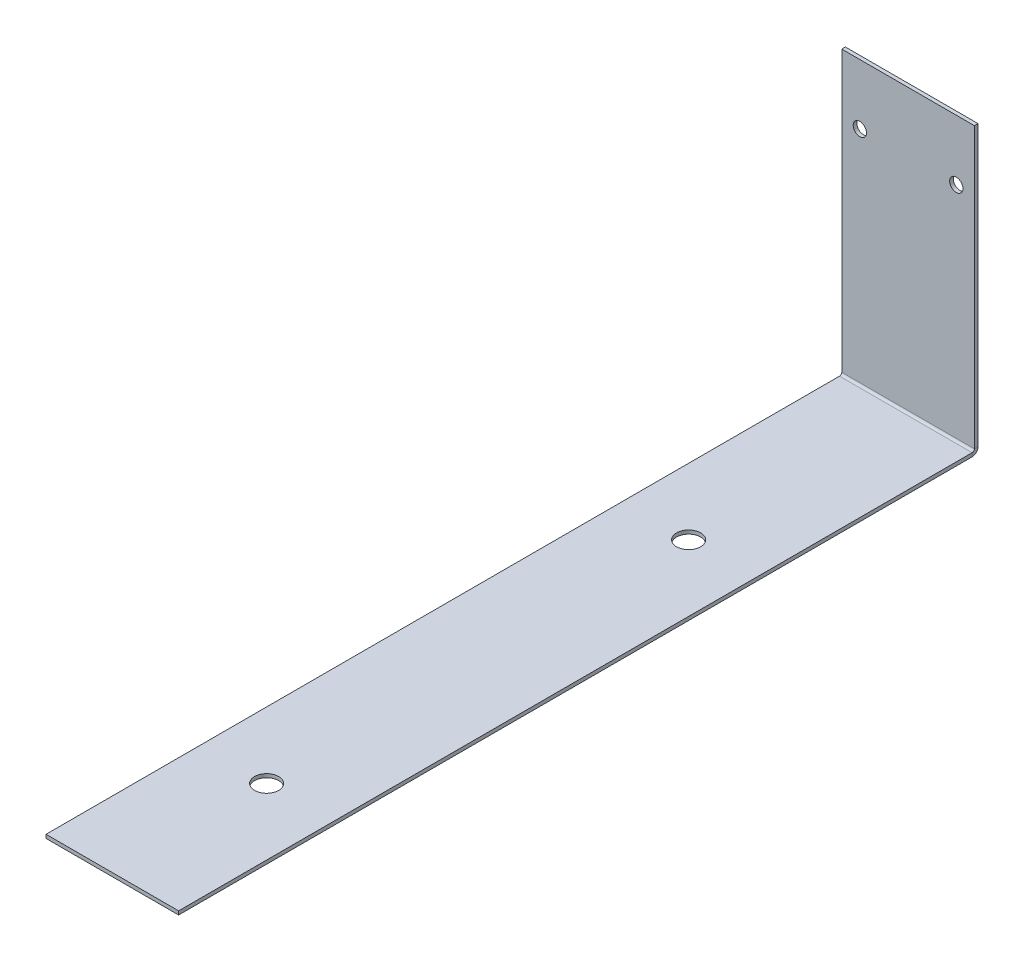
ISO-10303-21;
HEADER;
FILE_DESCRIPTION(('STEP AP214'),'2;1');
FILE_NAME('part.step','',(''),(''),'','','');
FILE_SCHEMA(('AUTOMOTIVE_DESIGN { 1 0 10303 214 1 1 1 1 }'));
ENDSEC;
DATA;
#1=APPLICATION_CONTEXT('core data for automotive mechanical design processes');
#2=APPLICATION_PROTOCOL_DEFINITION('international standard','automotive_design',2000,#1);
#3=PRODUCT_CONTEXT('',#1,'mechanical');
#4=PRODUCT('Part','Part','',(#3));
#5=PRODUCT_RELATED_PRODUCT_CATEGORY('part','',(#4));
#6=PRODUCT_DEFINITION_FORMATION('','',#4);
#7=PRODUCT_DEFINITION_CONTEXT('part definition',#1,'design');
#8=PRODUCT_DEFINITION('design','',#6,#7);
#9=PRODUCT_DEFINITION_SHAPE('','',#8);
#10=(LENGTH_UNIT() NAMED_UNIT(*) SI_UNIT(.MILLI.,.METRE.));
#11=(NAMED_UNIT(*) PLANE_ANGLE_UNIT() SI_UNIT($,.RADIAN.));
#12=(NAMED_UNIT(*) SI_UNIT($,.STERADIAN.) SOLID_ANGLE_UNIT());
#13=UNCERTAINTY_MEASURE_WITH_UNIT(LENGTH_MEASURE(1.E-05),#10,'distance_accuracy_value','');
#14=(GEOMETRIC_REPRESENTATION_CONTEXT(3) GLOBAL_UNCERTAINTY_ASSIGNED_CONTEXT((#13)) GLOBAL_UNIT_ASSIGNED_CONTEXT((#10,
#11,#12)) REPRESENTATION_CONTEXT('',''));
#15=CARTESIAN_POINT('',(0.,0.,0.));
#16=DIRECTION('',(0.,0.,1.));
#17=DIRECTION('',(1.,0.,0.));
#18=AXIS2_PLACEMENT_3D('',#15,#16,#17);
#19=CARTESIAN_POINT('',(0.,-86.4,-84.0000000000003));
#20=DIRECTION('',(0.,0.,-1.));
#21=DIRECTION('',(0.,1.,0.));
#22=AXIS2_PLACEMENT_3D('',#19,#20,#21);
#23=PLANE('',#22);
#24=CARTESIAN_POINT('',(15.9999999999999,73.5999999999999,-83.9999999999998));
#25=DIRECTION('',(0.,0.,-1.));
#26=DIRECTION('',(0.,1.,0.));
#27=AXIS2_PLACEMENT_3D('',#24,#25,#26);
#28=CIRCLE('',#27,2.20564156926429);
#29=CARTESIAN_POINT('',(15.9999999999999,75.8056415692642,-83.9999999999998));
#30=VERTEX_POINT('',#29);
#31=EDGE_CURVE('E216',#30,#30,#28,.T.);
#32=ORIENTED_EDGE('',*,*,#31,.T.);
#33=EDGE_LOOP('',(#32));
#34=FACE_BOUND('',#33,.T.);
#35=CARTESIAN_POINT('',(-16.0000000000001,73.5999999999999,-83.9999999999997));
#36=DIRECTION('',(0.,0.,-1.));
#37=DIRECTION('',(0.,1.,0.));
#38=AXIS2_PLACEMENT_3D('',#35,#36,#37);
#39=CIRCLE('',#38,2.20564156926428);
#40=CARTESIAN_POINT('',(-16.0000000000001,75.8056415692642,-83.9999999999997));
#41=VERTEX_POINT('',#40);
#42=EDGE_CURVE('E211',#41,#41,#39,.T.);
#43=ORIENTED_EDGE('',*,*,#42,.T.);
#44=EDGE_LOOP('',(#43));
#45=FACE_BOUND('',#44,.T.);
#46=DIRECTION('',(0.,-1.,0.));
#47=VECTOR('',#46,1.);
#48=CARTESIAN_POINT('',(-22.,93.6,-83.9999999999997));
#49=LINE('',#48,#47);
#50=CARTESIAN_POINT('',(-22.,93.6,-83.9999999999997));
#51=VERTEX_POINT('',#50);
#52=CARTESIAN_POINT('',(-22.,0.736600000000018,-84.));
#53=VERTEX_POINT('',#52);
#54=EDGE_CURVE('E66',#51,#53,#49,.T.);
#55=ORIENTED_EDGE('',*,*,#54,.T.);
#56=DIRECTION('',(1.,0.,0.));
#57=VECTOR('',#56,1.);
#58=CARTESIAN_POINT('',(0.,0.73659999999999,-84.));
#59=LINE('',#58,#57);
#60=CARTESIAN_POINT('',(22.,0.736600000000018,-84.));
#61=VERTEX_POINT('',#60);
#62=EDGE_CURVE('E58',#53,#61,#59,.T.);
#63=ORIENTED_EDGE('',*,*,#62,.T.);
#64=DIRECTION('',(0.,1.,0.));
#65=VECTOR('',#64,1.);
#66=CARTESIAN_POINT('',(22.,93.6,-83.9999999999997));
#67=LINE('',#66,#65);
#68=CARTESIAN_POINT('',(22.,93.6,-83.9999999999997));
#69=VERTEX_POINT('',#68);
#70=EDGE_CURVE('E74',#61,#69,#67,.T.);
#71=ORIENTED_EDGE('',*,*,#70,.T.);
#72=DIRECTION('',(-1.,0.,0.));
#73=VECTOR('',#72,1.);
#74=CARTESIAN_POINT('',(22.,93.6,-83.9999999999997));
#75=LINE('',#74,#73);
#76=EDGE_CURVE('E177',#69,#51,#75,.T.);
#77=ORIENTED_EDGE('',*,*,#76,.T.);
#78=EDGE_LOOP('',(#55,#63,#71,#77));
#79=FACE_BOUND('',#78,.T.);
#80=ADVANCED_FACE('F49',(#34,#45,#79),#23,.F.);
#81=CARTESIAN_POINT('',(-22.,93.6,-85.1999999999997));
#82=DIRECTION('',(-1.,0.,0.));
#83=DIRECTION('',(0.,-1.,0.));
#84=AXIS2_PLACEMENT_3D('',#81,#82,#83);
#85=PLANE('',#84);
#86=DIRECTION('',(0.,0.,-1.));
#87=VECTOR('',#86,1.);
#88=CARTESIAN_POINT('',(-22.,0.73659999999999,-85.2));
#89=LINE('',#88,#87);
#90=CARTESIAN_POINT('',(-22.,0.736600000000032,-85.2));
#91=VERTEX_POINT('',#90);
#92=EDGE_CURVE('E12',#53,#91,#89,.T.);
#93=ORIENTED_EDGE('',*,*,#92,.F.);
#94=ORIENTED_EDGE('',*,*,#54,.F.);
#95=DIRECTION('',(0.,0.,1.));
#96=VECTOR('',#95,1.);
#97=CARTESIAN_POINT('',(-22.,93.6,-85.1999999999997));
#98=LINE('',#97,#96);
#99=CARTESIAN_POINT('',(-22.,93.6,-85.1999999999997));
#100=VERTEX_POINT('',#99);
#101=EDGE_CURVE('E180',#100,#51,#98,.T.);
#102=ORIENTED_EDGE('',*,*,#101,.F.);
#103=DIRECTION('',(0.,-1.,0.));
#104=VECTOR('',#103,1.);
#105=CARTESIAN_POINT('',(-22.,93.6,-85.1999999999997));
#106=LINE('',#105,#104);
#107=EDGE_CURVE('E179',#100,#91,#106,.T.);
#108=ORIENTED_EDGE('',*,*,#107,.T.);
#109=EDGE_LOOP('',(#93,#94,#102,#108));
#110=FACE_BOUND('',#109,.T.);
#111=ADVANCED_FACE('F51',(#110),#85,.T.);
#112=CARTESIAN_POINT('',(22.,93.6,-85.1999999999997));
#113=DIRECTION('',(0.,1.,0.));
#114=DIRECTION('',(-1.,0.,0.));
#115=AXIS2_PLACEMENT_3D('',#112,#113,#114);
#116=PLANE('',#115);
#117=ORIENTED_EDGE('',*,*,#76,.F.);
#118=DIRECTION('',(0.,0.,1.));
#119=VECTOR('',#118,1.);
#120=CARTESIAN_POINT('',(22.,93.6,-85.1999999999997));
#121=LINE('',#120,#119);
#122=CARTESIAN_POINT('',(22.,93.6,-85.1999999999997));
#123=VERTEX_POINT('',#122);
#124=EDGE_CURVE('E175',#123,#69,#121,.T.);
#125=ORIENTED_EDGE('',*,*,#124,.F.);
#126=DIRECTION('',(-1.,0.,0.));
#127=VECTOR('',#126,1.);
#128=CARTESIAN_POINT('',(22.,93.6,-85.1999999999997));
#129=LINE('',#128,#127);
#130=EDGE_CURVE('E172',#123,#100,#129,.T.);
#131=ORIENTED_EDGE('',*,*,#130,.T.);
#132=ORIENTED_EDGE('',*,*,#101,.T.);
#133=EDGE_LOOP('',(#117,#125,#131,#132));
#134=FACE_BOUND('',#133,.T.);
#135=ADVANCED_FACE('F244',(#134),#116,.T.);
#136=CARTESIAN_POINT('',(22.,93.6,-85.1999999999997));
#137=DIRECTION('',(1.,0.,0.));
#138=DIRECTION('',(0.,1.,0.));
#139=AXIS2_PLACEMENT_3D('',#136,#137,#138);
#140=PLANE('',#139);
#141=DIRECTION('',(0.,0.,1.));
#142=VECTOR('',#141,1.);
#143=CARTESIAN_POINT('',(22.,0.73659999999999,-85.2));
#144=LINE('',#143,#142);
#145=CARTESIAN_POINT('',(22.,0.736600000000002,-85.2));
#146=VERTEX_POINT('',#145);
#147=EDGE_CURVE('E185',#146,#61,#144,.T.);
#148=ORIENTED_EDGE('',*,*,#147,.F.);
#149=DIRECTION('',(0.,1.,0.));
#150=VECTOR('',#149,1.);
#151=CARTESIAN_POINT('',(22.,93.6,-85.1999999999997));
#152=LINE('',#151,#150);
#153=EDGE_CURVE('E176',#146,#123,#152,.T.);
#154=ORIENTED_EDGE('',*,*,#153,.T.);
#155=ORIENTED_EDGE('',*,*,#124,.T.);
#156=ORIENTED_EDGE('',*,*,#70,.F.);
#157=EDGE_LOOP('',(#148,#154,#155,#156));
#158=FACE_BOUND('',#157,.T.);
#159=ADVANCED_FACE('F236',(#158),#140,.T.);
#160=CARTESIAN_POINT('',(0.,-86.4,-85.2000000000003));
#161=DIRECTION('',(0.,0.,-1.));
#162=DIRECTION('',(0.,1.,0.));
#163=AXIS2_PLACEMENT_3D('',#160,#161,#162);
#164=PLANE('',#163);
#165=CARTESIAN_POINT('',(15.9999999999999,73.5999999999999,-85.1999999999997));
#166=DIRECTION('',(0.,0.,-1.));
#167=DIRECTION('',(0.,1.,0.));
#168=AXIS2_PLACEMENT_3D('',#165,#166,#167);
#169=CIRCLE('',#168,2.20564156926429);
#170=CARTESIAN_POINT('',(15.9999999999999,75.8056415692642,-85.1999999999997));
#171=VERTEX_POINT('',#170);
#172=EDGE_CURVE('E208',#171,#171,#169,.T.);
#173=ORIENTED_EDGE('',*,*,#172,.F.);
#174=EDGE_LOOP('',(#173));
#175=FACE_BOUND('',#174,.T.);
#176=CARTESIAN_POINT('',(-16.0000000000001,73.5999999999999,-85.1999999999997));
#177=DIRECTION('',(0.,0.,-1.));
#178=DIRECTION('',(0.,-1.,0.));
#179=AXIS2_PLACEMENT_3D('',#176,#177,#178);
#180=CIRCLE('',#179,2.20564156926428);
#181=CARTESIAN_POINT('',(-16.0000000000001,71.3943584307357,-85.1999999999998));
#182=VERTEX_POINT('',#181);
#183=EDGE_CURVE('E199',#182,#182,#180,.T.);
#184=ORIENTED_EDGE('',*,*,#183,.F.);
#185=EDGE_LOOP('',(#184));
#186=FACE_BOUND('',#185,.T.);
#187=DIRECTION('',(1.,0.,0.));
#188=VECTOR('',#187,1.);
#189=CARTESIAN_POINT('',(0.,0.73659999999999,-85.2));
#190=LINE('',#189,#188);
#191=EDGE_CURVE('E182',#91,#146,#190,.T.);
#192=ORIENTED_EDGE('',*,*,#191,.F.);
#193=ORIENTED_EDGE('',*,*,#107,.F.);
#194=ORIENTED_EDGE('',*,*,#130,.F.);
#195=ORIENTED_EDGE('',*,*,#153,.F.);
#196=EDGE_LOOP('',(#192,#193,#194,#195));
#197=FACE_BOUND('',#196,.T.);
#198=ADVANCED_FACE('F240',(#175,#186,#197),#164,.T.);
#199=CARTESIAN_POINT('',(22.,-1.2,180.));
#200=DIRECTION('',(0.,0.,1.));
#201=DIRECTION('',(1.,0.,0.));
#202=AXIS2_PLACEMENT_3D('',#199,#200,#201);
#203=PLANE('',#202);
#204=DIRECTION('',(1.,0.,0.));
#205=VECTOR('',#204,1.);
#206=CARTESIAN_POINT('',(22.,0.,180.));
#207=LINE('',#206,#205);
#208=CARTESIAN_POINT('',(-22.,0.,180.));
#209=VERTEX_POINT('',#208);
#210=CARTESIAN_POINT('',(22.,0.,180.));
#211=VERTEX_POINT('',#210);
#212=EDGE_CURVE('E157',#209,#211,#207,.T.);
#213=ORIENTED_EDGE('',*,*,#212,.F.);
#214=DIRECTION('',(0.,1.,0.));
#215=VECTOR('',#214,1.);
#216=CARTESIAN_POINT('',(-22.,-1.2,180.));
#217=LINE('',#216,#215);
#218=CARTESIAN_POINT('',(-22.,-1.2,180.));
#219=VERTEX_POINT('',#218);
#220=EDGE_CURVE('E148',#219,#209,#217,.T.);
#221=ORIENTED_EDGE('',*,*,#220,.F.);
#222=DIRECTION('',(1.,0.,0.));
#223=VECTOR('',#222,1.);
#224=CARTESIAN_POINT('',(22.,-1.2,180.));
#225=LINE('',#224,#223);
#226=CARTESIAN_POINT('',(22.,-1.2,180.));
#227=VERTEX_POINT('',#226);
#228=EDGE_CURVE('E144',#219,#227,#225,.T.);
#229=ORIENTED_EDGE('',*,*,#228,.T.);
#230=DIRECTION('',(0.,1.,0.));
#231=VECTOR('',#230,1.);
#232=CARTESIAN_POINT('',(22.,-1.2,180.));
#233=LINE('',#232,#231);
#234=EDGE_CURVE('E138',#227,#211,#233,.T.);
#235=ORIENTED_EDGE('',*,*,#234,.T.);
#236=EDGE_LOOP('',(#213,#221,#229,#235));
#237=FACE_BOUND('',#236,.T.);
#238=ADVANCED_FACE('F225',(#237),#203,.T.);
#239=CARTESIAN_POINT('',(0.,-1.2,0.));
#240=DIRECTION('',(0.,-1.,0.));
#241=DIRECTION('',(0.,0.,-1.));
#242=AXIS2_PLACEMENT_3D('',#239,#240,#241);
#243=PLANE('',#242);
#244=CARTESIAN_POINT('',(0.,-1.2,-11.2));
#245=DIRECTION('',(0.,-1.,0.));
#246=DIRECTION('',(0.,0.,-1.));
#247=AXIS2_PLACEMENT_3D('',#244,#245,#246);
#248=CIRCLE('',#247,4.);
#249=CARTESIAN_POINT('',(0.,-1.2,-15.2));
#250=VERTEX_POINT('',#249);
#251=EDGE_CURVE('E195',#250,#250,#248,.T.);
#252=ORIENTED_EDGE('',*,*,#251,.F.);
#253=EDGE_LOOP('',(#252));
#254=FACE_BOUND('',#253,.T.);
#255=CARTESIAN_POINT('',(0.,-1.2,128.8));
#256=DIRECTION('',(0.,-1.,0.));
#257=DIRECTION('',(0.,0.,-1.));
#258=AXIS2_PLACEMENT_3D('',#255,#256,#257);
#259=CIRCLE('',#258,4.);
#260=CARTESIAN_POINT('',(0.,-1.2,124.8));
#261=VERTEX_POINT('',#260);
#262=EDGE_CURVE('E201',#261,#261,#259,.T.);
#263=ORIENTED_EDGE('',*,*,#262,.F.);
#264=EDGE_LOOP('',(#263));
#265=FACE_BOUND('',#264,.T.);
#266=DIRECTION('',(0.,0.,1.));
#267=VECTOR('',#266,1.);
#268=CARTESIAN_POINT('',(-22.,-1.2,-180.));
#269=LINE('',#268,#267);
#270=CARTESIAN_POINT('',(-22.,-1.2,-83.2634));
#271=VERTEX_POINT('',#270);
#272=EDGE_CURVE('E141',#271,#219,#269,.T.);
#273=ORIENTED_EDGE('',*,*,#272,.F.);
#274=DIRECTION('',(1.,0.,0.));
#275=VECTOR('',#274,1.);
#276=CARTESIAN_POINT('',(0.,-1.2,-83.2634));
#277=LINE('',#276,#275);
#278=CARTESIAN_POINT('',(22.,-1.2,-83.2634));
#279=VERTEX_POINT('',#278);
#280=EDGE_CURVE('E130',#271,#279,#277,.T.);
#281=ORIENTED_EDGE('',*,*,#280,.T.);
#282=DIRECTION('',(0.,0.,-1.));
#283=VECTOR('',#282,1.);
#284=CARTESIAN_POINT('',(22.,-1.2,-180.));
#285=LINE('',#284,#283);
#286=EDGE_CURVE('E137',#227,#279,#285,.T.);
#287=ORIENTED_EDGE('',*,*,#286,.F.);
#288=ORIENTED_EDGE('',*,*,#228,.F.);
#289=EDGE_LOOP('',(#273,#281,#287,#288));
#290=FACE_BOUND('',#289,.T.);
#291=ADVANCED_FACE('F142',(#254,#265,#290),#243,.T.);
#292=CARTESIAN_POINT('',(22.,-1.2,-180.));
#293=DIRECTION('',(1.,0.,0.));
#294=DIRECTION('',(0.,0.,-1.));
#295=AXIS2_PLACEMENT_3D('',#292,#293,#294);
#296=PLANE('',#295);
#297=ORIENTED_EDGE('',*,*,#286,.T.);
#298=DIRECTION('',(0.,1.,0.));
#299=VECTOR('',#298,1.);
#300=CARTESIAN_POINT('',(22.,-1.19999999999999,-83.2634));
#301=LINE('',#300,#299);
#302=CARTESIAN_POINT('',(22.,0.,-83.2634));
#303=VERTEX_POINT('',#302);
#304=EDGE_CURVE('E164',#279,#303,#301,.T.);
#305=ORIENTED_EDGE('',*,*,#304,.T.);
#306=DIRECTION('',(0.,0.,-1.));
#307=VECTOR('',#306,1.);
#308=CARTESIAN_POINT('',(22.,0.,-180.));
#309=LINE('',#308,#307);
#310=EDGE_CURVE('E154',#211,#303,#309,.T.);
#311=ORIENTED_EDGE('',*,*,#310,.F.);
#312=ORIENTED_EDGE('',*,*,#234,.F.);
#313=EDGE_LOOP('',(#297,#305,#311,#312));
#314=FACE_BOUND('',#313,.T.);
#315=ADVANCED_FACE('F265',(#314),#296,.T.);
#316=CARTESIAN_POINT('',(0.,0.,0.));
#317=DIRECTION('',(0.,-1.,0.));
#318=DIRECTION('',(0.,0.,-1.));
#319=AXIS2_PLACEMENT_3D('',#316,#317,#318);
#320=PLANE('',#319);
#321=CARTESIAN_POINT('',(0.,0.,-11.2));
#322=DIRECTION('',(0.,-1.,0.));
#323=DIRECTION('',(0.,0.,-1.));
#324=AXIS2_PLACEMENT_3D('',#321,#322,#323);
#325=CIRCLE('',#324,4.);
#326=CARTESIAN_POINT('',(0.,0.,-15.2));
#327=VERTEX_POINT('',#326);
#328=EDGE_CURVE('E53',#327,#327,#325,.T.);
#329=ORIENTED_EDGE('',*,*,#328,.T.);
#330=EDGE_LOOP('',(#329));
#331=FACE_BOUND('',#330,.T.);
#332=CARTESIAN_POINT('',(0.,0.,128.8));
#333=DIRECTION('',(0.,-1.,0.));
#334=DIRECTION('',(0.,0.,-1.));
#335=AXIS2_PLACEMENT_3D('',#332,#333,#334);
#336=CIRCLE('',#335,4.);
#337=CARTESIAN_POINT('',(0.,0.,124.8));
#338=VERTEX_POINT('',#337);
#339=EDGE_CURVE('E193',#338,#338,#336,.T.);
#340=ORIENTED_EDGE('',*,*,#339,.T.);
#341=EDGE_LOOP('',(#340));
#342=FACE_BOUND('',#341,.T.);
#343=DIRECTION('',(1.,0.,0.));
#344=VECTOR('',#343,1.);
#345=CARTESIAN_POINT('',(0.,0.,-83.2634));
#346=LINE('',#345,#344);
#347=CARTESIAN_POINT('',(-22.,0.,-83.2634));
#348=VERTEX_POINT('',#347);
#349=EDGE_CURVE('E170',#348,#303,#346,.T.);
#350=ORIENTED_EDGE('',*,*,#349,.F.);
#351=DIRECTION('',(0.,0.,1.));
#352=VECTOR('',#351,1.);
#353=CARTESIAN_POINT('',(-22.,0.,-180.));
#354=LINE('',#353,#352);
#355=EDGE_CURVE('E152',#348,#209,#354,.T.);
#356=ORIENTED_EDGE('',*,*,#355,.T.);
#357=ORIENTED_EDGE('',*,*,#212,.T.);
#358=ORIENTED_EDGE('',*,*,#310,.T.);
#359=EDGE_LOOP('',(#350,#356,#357,#358));
#360=FACE_BOUND('',#359,.T.);
#361=ADVANCED_FACE('F228',(#331,#342,#360),#320,.F.);
#362=CARTESIAN_POINT('',(-22.,-1.2,-180.));
#363=DIRECTION('',(-1.,0.,0.));
#364=DIRECTION('',(0.,0.,1.));
#365=AXIS2_PLACEMENT_3D('',#362,#363,#364);
#366=PLANE('',#365);
#367=ORIENTED_EDGE('',*,*,#355,.F.);
#368=DIRECTION('',(0.,-1.,0.));
#369=VECTOR('',#368,1.);
#370=CARTESIAN_POINT('',(-22.,-1.19999999999999,-83.2634));
#371=LINE('',#370,#369);
#372=EDGE_CURVE('E121',#348,#271,#371,.T.);
#373=ORIENTED_EDGE('',*,*,#372,.T.);
#374=ORIENTED_EDGE('',*,*,#272,.T.);
#375=ORIENTED_EDGE('',*,*,#220,.T.);
#376=EDGE_LOOP('',(#367,#373,#374,#375));
#377=FACE_BOUND('',#376,.T.);
#378=ADVANCED_FACE('F151',(#377),#366,.T.);
#379=CARTESIAN_POINT('',(-22.,0.7366,-83.2634));
#380=DIRECTION('',(-1.,0.,0.));
#381=DIRECTION('',(0.,0.,1.));
#382=AXIS2_PLACEMENT_3D('',#379,#380,#381);
#383=PLANE('',#382);
#384=ORIENTED_EDGE('',*,*,#372,.F.);
#385=CARTESIAN_POINT('',(-22.,0.7366,-83.2634));
#386=DIRECTION('',(1.,0.,0.));
#387=DIRECTION('',(0.,0.,-1.));
#388=AXIS2_PLACEMENT_3D('',#385,#386,#387);
#389=CIRCLE('',#388,0.7366);
#390=EDGE_CURVE('E218',#348,#53,#389,.T.);
#391=ORIENTED_EDGE('',*,*,#390,.T.);
#392=ORIENTED_EDGE('',*,*,#92,.T.);
#393=CARTESIAN_POINT('',(-22.,0.7366,-83.2634));
#394=DIRECTION('',(1.,0.,0.));
#395=DIRECTION('',(0.,0.,1.));
#396=AXIS2_PLACEMENT_3D('',#393,#394,#395);
#397=CIRCLE('',#396,1.9366);
#398=EDGE_CURVE('E116',#271,#91,#397,.T.);
#399=ORIENTED_EDGE('',*,*,#398,.F.);
#400=EDGE_LOOP('',(#384,#391,#392,#399));
#401=FACE_BOUND('',#400,.T.);
#402=ADVANCED_FACE('F118',(#401),#383,.T.);
#403=CARTESIAN_POINT('',(22.,0.7366,-83.2634));
#404=DIRECTION('',(1.,0.,0.));
#405=DIRECTION('',(0.,0.,-1.));
#406=AXIS2_PLACEMENT_3D('',#403,#404,#405);
#407=PLANE('',#406);
#408=ORIENTED_EDGE('',*,*,#147,.T.);
#409=CARTESIAN_POINT('',(22.,0.7366,-83.2634));
#410=DIRECTION('',(1.,0.,0.));
#411=DIRECTION('',(0.,0.,-1.));
#412=AXIS2_PLACEMENT_3D('',#409,#410,#411);
#413=CIRCLE('',#412,0.7366);
#414=EDGE_CURVE('E126',#61,#303,#413,.F.);
#415=ORIENTED_EDGE('',*,*,#414,.T.);
#416=ORIENTED_EDGE('',*,*,#304,.F.);
#417=CARTESIAN_POINT('',(22.,0.7366,-83.2634));
#418=DIRECTION('',(-1.,0.,0.));
#419=DIRECTION('',(0.,0.,-1.));
#420=AXIS2_PLACEMENT_3D('',#417,#418,#419);
#421=CIRCLE('',#420,1.9366);
#422=EDGE_CURVE('E125',#146,#279,#421,.T.);
#423=ORIENTED_EDGE('',*,*,#422,.F.);
#424=EDGE_LOOP('',(#408,#415,#416,#423));
#425=FACE_BOUND('',#424,.T.);
#426=ADVANCED_FACE('F234',(#425),#407,.T.);
#427=CARTESIAN_POINT('',(-44.1864422446524,0.7366,-83.2634));
#428=DIRECTION('',(1.,0.,0.));
#429=DIRECTION('',(0.,0.,-1.));
#430=AXIS2_PLACEMENT_3D('',#427,#428,#429);
#431=CYLINDRICAL_SURFACE('',#430,1.9366);
#432=ORIENTED_EDGE('',*,*,#422,.T.);
#433=ORIENTED_EDGE('',*,*,#280,.F.);
#434=ORIENTED_EDGE('',*,*,#398,.T.);
#435=ORIENTED_EDGE('',*,*,#191,.T.);
#436=EDGE_LOOP('',(#432,#433,#434,#435));
#437=FACE_BOUND('',#436,.T.);
#438=ADVANCED_FACE('F132',(#437),#431,.T.);
#439=CARTESIAN_POINT('',(-44.1864422446524,0.7366,-83.2634));
#440=DIRECTION('',(1.,0.,0.));
#441=DIRECTION('',(0.,0.,-1.));
#442=AXIS2_PLACEMENT_3D('',#439,#440,#441);
#443=CYLINDRICAL_SURFACE('',#442,0.7366);
#444=ORIENTED_EDGE('',*,*,#414,.F.);
#445=ORIENTED_EDGE('',*,*,#62,.F.);
#446=ORIENTED_EDGE('',*,*,#390,.F.);
#447=ORIENTED_EDGE('',*,*,#349,.T.);
#448=EDGE_LOOP('',(#444,#445,#446,#447));
#449=FACE_BOUND('',#448,.T.);
#450=ADVANCED_FACE('F231',(#449),#443,.F.);
#451=CARTESIAN_POINT('',(-16.0000000000001,73.5999999999999,-75.1999999999997));
#452=DIRECTION('',(0.,0.,-1.));
#453=DIRECTION('',(0.,1.,0.));
#454=AXIS2_PLACEMENT_3D('',#451,#452,#453);
#455=CYLINDRICAL_SURFACE('',#454,2.20564156926428);
#456=ORIENTED_EDGE('',*,*,#183,.T.);
#457=EDGE_LOOP('',(#456));
#458=FACE_BOUND('',#457,.T.);
#459=ORIENTED_EDGE('',*,*,#42,.F.);
#460=EDGE_LOOP('',(#459));
#461=FACE_BOUND('',#460,.T.);
#462=ADVANCED_FACE('F280',(#458,#461),#455,.F.);
#463=CARTESIAN_POINT('',(15.9999999999999,73.5999999999999,-75.1999999999997));
#464=DIRECTION('',(0.,0.,-1.));
#465=DIRECTION('',(0.,1.,0.));
#466=AXIS2_PLACEMENT_3D('',#463,#464,#465);
#467=CYLINDRICAL_SURFACE('',#466,2.20564156926429);
#468=ORIENTED_EDGE('',*,*,#172,.T.);
#469=EDGE_LOOP('',(#468));
#470=FACE_BOUND('',#469,.T.);
#471=ORIENTED_EDGE('',*,*,#31,.F.);
#472=EDGE_LOOP('',(#471));
#473=FACE_BOUND('',#472,.T.);
#474=ADVANCED_FACE('F285',(#470,#473),#467,.F.);
#475=CARTESIAN_POINT('',(0.,8.8,128.8));
#476=DIRECTION('',(0.,-1.,0.));
#477=DIRECTION('',(0.,0.,-1.));
#478=AXIS2_PLACEMENT_3D('',#475,#476,#477);
#479=CYLINDRICAL_SURFACE('',#478,4.);
#480=ORIENTED_EDGE('',*,*,#262,.T.);
#481=EDGE_LOOP('',(#480));
#482=FACE_BOUND('',#481,.T.);
#483=ORIENTED_EDGE('',*,*,#339,.F.);
#484=EDGE_LOOP('',(#483));
#485=FACE_BOUND('',#484,.T.);
#486=ADVANCED_FACE('F289',(#482,#485),#479,.F.);
#487=CARTESIAN_POINT('',(0.,8.8,-11.2));
#488=DIRECTION('',(0.,-1.,0.));
#489=DIRECTION('',(0.,0.,-1.));
#490=AXIS2_PLACEMENT_3D('',#487,#488,#489);
#491=CYLINDRICAL_SURFACE('',#490,4.);
#492=ORIENTED_EDGE('',*,*,#251,.T.);
#493=EDGE_LOOP('',(#492));
#494=FACE_BOUND('',#493,.T.);
#495=ORIENTED_EDGE('',*,*,#328,.F.);
#496=EDGE_LOOP('',(#495));
#497=FACE_BOUND('',#496,.T.);
#498=ADVANCED_FACE('F293',(#494,#497),#491,.F.);
#499=CLOSED_SHELL('',(#80,#111,#135,#159,#198,#238,#291,#315,#361,#378,#402,#426,#438,#450,#462,
#474,#486,#498));
#500=MANIFOLD_SOLID_BREP('B2',#499);
#501=ADVANCED_BREP_SHAPE_REPRESENTATION('',(#18,#500),#14);
#502=SHAPE_DEFINITION_REPRESENTATION(#9,#501);
ENDSEC;
END-ISO-10303-21;
